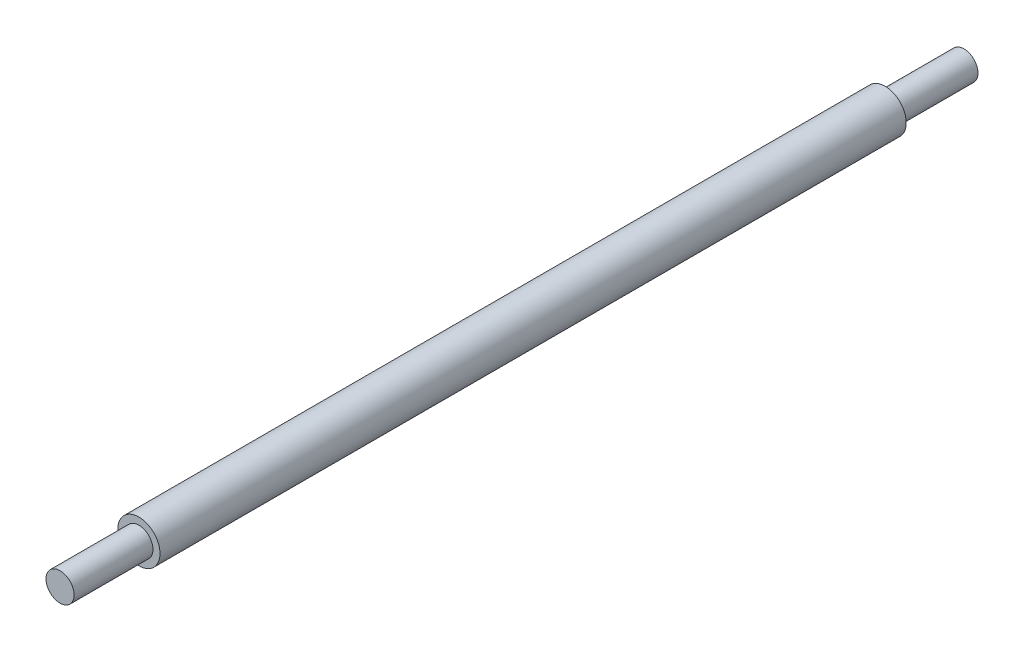
ISO-10303-21;
HEADER;
FILE_DESCRIPTION(('STEP AP214'),'2;1');
FILE_NAME('part.step','',(''),(''),'','','');
FILE_SCHEMA(('AUTOMOTIVE_DESIGN { 1 0 10303 214 1 1 1 1 }'));
ENDSEC;
DATA;
#1=APPLICATION_CONTEXT('core data for automotive mechanical design processes');
#2=APPLICATION_PROTOCOL_DEFINITION('international standard','automotive_design',2000,#1);
#3=PRODUCT_CONTEXT('',#1,'mechanical');
#4=PRODUCT('Part','Part','',(#3));
#5=PRODUCT_RELATED_PRODUCT_CATEGORY('part','',(#4));
#6=PRODUCT_DEFINITION_FORMATION('','',#4);
#7=PRODUCT_DEFINITION_CONTEXT('part definition',#1,'design');
#8=PRODUCT_DEFINITION('design','',#6,#7);
#9=PRODUCT_DEFINITION_SHAPE('','',#8);
#10=(LENGTH_UNIT() NAMED_UNIT(*) SI_UNIT(.MILLI.,.METRE.));
#11=(NAMED_UNIT(*) PLANE_ANGLE_UNIT() SI_UNIT($,.RADIAN.));
#12=(NAMED_UNIT(*) SI_UNIT($,.STERADIAN.) SOLID_ANGLE_UNIT());
#13=UNCERTAINTY_MEASURE_WITH_UNIT(LENGTH_MEASURE(1.E-05),#10,'distance_accuracy_value','');
#14=(GEOMETRIC_REPRESENTATION_CONTEXT(3) GLOBAL_UNCERTAINTY_ASSIGNED_CONTEXT((#13)) GLOBAL_UNIT_ASSIGNED_CONTEXT((#10,
#11,#12)) REPRESENTATION_CONTEXT('',''));
#15=CARTESIAN_POINT('',(0.,0.,0.));
#16=DIRECTION('',(0.,0.,1.));
#17=DIRECTION('',(1.,0.,0.));
#18=AXIS2_PLACEMENT_3D('',#15,#16,#17);
#19=CARTESIAN_POINT('',(0.,0.,336.55));
#20=DIRECTION('',(0.,0.,-1.));
#21=DIRECTION('',(-1.,0.,0.));
#22=AXIS2_PLACEMENT_3D('',#19,#20,#21);
#23=CYLINDRICAL_SURFACE('',#22,9.525);
#24=CARTESIAN_POINT('',(0.,0.,336.55));
#25=DIRECTION('',(0.,0.,1.));
#26=DIRECTION('',(1.,0.,0.));
#27=AXIS2_PLACEMENT_3D('',#24,#25,#26);
#28=CIRCLE('',#27,9.525);
#29=CARTESIAN_POINT('',(9.525,0.,336.55));
#30=VERTEX_POINT('',#29);
#31=EDGE_CURVE('E54',#30,#30,#28,.T.);
#32=ORIENTED_EDGE('',*,*,#31,.F.);
#33=EDGE_LOOP('',(#32));
#34=FACE_BOUND('',#33,.T.);
#35=CARTESIAN_POINT('',(0.,0.,0.));
#36=DIRECTION('',(0.,0.,1.));
#37=DIRECTION('',(1.,0.,0.));
#38=AXIS2_PLACEMENT_3D('',#35,#36,#37);
#39=CIRCLE('',#38,9.525);
#40=CARTESIAN_POINT('',(9.525,0.,0.));
#41=VERTEX_POINT('',#40);
#42=EDGE_CURVE('E45',#41,#41,#39,.T.);
#43=ORIENTED_EDGE('',*,*,#42,.T.);
#44=EDGE_LOOP('',(#43));
#45=FACE_BOUND('',#44,.T.);
#46=ADVANCED_FACE('F42',(#34,#45),#23,.T.);
#47=CARTESIAN_POINT('',(0.,0.,336.55));
#48=DIRECTION('',(0.,0.,1.));
#49=DIRECTION('',(1.,0.,0.));
#50=AXIS2_PLACEMENT_3D('',#47,#48,#49);
#51=PLANE('',#50);
#52=CARTESIAN_POINT('',(0.,0.,336.55));
#53=DIRECTION('',(0.,0.,1.));
#54=DIRECTION('',(1.,0.,0.));
#55=AXIS2_PLACEMENT_3D('',#52,#53,#54);
#56=CIRCLE('',#55,6.35);
#57=CARTESIAN_POINT('',(6.35,0.,336.55));
#58=VERTEX_POINT('',#57);
#59=EDGE_CURVE('E49',#58,#58,#56,.T.);
#60=ORIENTED_EDGE('',*,*,#59,.F.);
#61=EDGE_LOOP('',(#60));
#62=FACE_BOUND('',#61,.T.);
#63=ORIENTED_EDGE('',*,*,#31,.T.);
#64=EDGE_LOOP('',(#63));
#65=FACE_BOUND('',#64,.T.);
#66=ADVANCED_FACE('F71',(#62,#65),#51,.T.);
#67=CARTESIAN_POINT('',(0.,0.,0.));
#68=DIRECTION('',(0.,0.,1.));
#69=DIRECTION('',(1.,0.,0.));
#70=AXIS2_PLACEMENT_3D('',#67,#68,#69);
#71=PLANE('',#70);
#72=CARTESIAN_POINT('',(0.,0.,0.));
#73=DIRECTION('',(0.,0.,-1.));
#74=DIRECTION('',(-1.,0.,0.));
#75=AXIS2_PLACEMENT_3D('',#72,#73,#74);
#76=CIRCLE('',#75,6.35);
#77=CARTESIAN_POINT('',(-6.35,0.,0.));
#78=VERTEX_POINT('',#77);
#79=EDGE_CURVE('E12',#78,#78,#76,.T.);
#80=ORIENTED_EDGE('',*,*,#79,.F.);
#81=EDGE_LOOP('',(#80));
#82=FACE_BOUND('',#81,.T.);
#83=ORIENTED_EDGE('',*,*,#42,.F.);
#84=EDGE_LOOP('',(#83));
#85=FACE_BOUND('',#84,.T.);
#86=ADVANCED_FACE('F68',(#82,#85),#71,.F.);
#87=CARTESIAN_POINT('',(0.,0.,372.11));
#88=DIRECTION('',(0.,0.,-1.));
#89=DIRECTION('',(-1.,0.,0.));
#90=AXIS2_PLACEMENT_3D('',#87,#88,#89);
#91=CYLINDRICAL_SURFACE('',#90,6.35);
#92=CARTESIAN_POINT('',(0.,0.,372.11));
#93=DIRECTION('',(0.,0.,1.));
#94=DIRECTION('',(1.,0.,0.));
#95=AXIS2_PLACEMENT_3D('',#92,#93,#94);
#96=CIRCLE('',#95,6.35);
#97=CARTESIAN_POINT('',(6.35,0.,372.11));
#98=VERTEX_POINT('',#97);
#99=EDGE_CURVE('E59',#98,#98,#96,.T.);
#100=ORIENTED_EDGE('',*,*,#99,.F.);
#101=EDGE_LOOP('',(#100));
#102=FACE_BOUND('',#101,.T.);
#103=ORIENTED_EDGE('',*,*,#59,.T.);
#104=EDGE_LOOP('',(#103));
#105=FACE_BOUND('',#104,.T.);
#106=ADVANCED_FACE('F70',(#102,#105),#91,.T.);
#107=CARTESIAN_POINT('',(0.,0.,372.11));
#108=DIRECTION('',(0.,0.,1.));
#109=DIRECTION('',(1.,0.,0.));
#110=AXIS2_PLACEMENT_3D('',#107,#108,#109);
#111=PLANE('',#110);
#112=ORIENTED_EDGE('',*,*,#99,.T.);
#113=EDGE_LOOP('',(#112));
#114=FACE_BOUND('',#113,.T.);
#115=ADVANCED_FACE('F77',(#114),#111,.T.);
#116=CARTESIAN_POINT('',(0.,0.,-35.56));
#117=DIRECTION('',(0.,0.,1.));
#118=DIRECTION('',(1.,0.,0.));
#119=AXIS2_PLACEMENT_3D('',#116,#117,#118);
#120=CYLINDRICAL_SURFACE('',#119,6.35);
#121=CARTESIAN_POINT('',(0.,0.,-35.56));
#122=DIRECTION('',(0.,0.,-1.));
#123=DIRECTION('',(-1.,0.,0.));
#124=AXIS2_PLACEMENT_3D('',#121,#122,#123);
#125=CIRCLE('',#124,6.35);
#126=CARTESIAN_POINT('',(-6.35,0.,-35.56));
#127=VERTEX_POINT('',#126);
#128=EDGE_CURVE('E58',#127,#127,#125,.T.);
#129=ORIENTED_EDGE('',*,*,#128,.F.);
#130=EDGE_LOOP('',(#129));
#131=FACE_BOUND('',#130,.T.);
#132=ORIENTED_EDGE('',*,*,#79,.T.);
#133=EDGE_LOOP('',(#132));
#134=FACE_BOUND('',#133,.T.);
#135=ADVANCED_FACE('F105',(#131,#134),#120,.T.);
#136=CARTESIAN_POINT('',(0.,0.,-35.56));
#137=DIRECTION('',(0.,0.,-1.));
#138=DIRECTION('',(-1.,0.,0.));
#139=AXIS2_PLACEMENT_3D('',#136,#137,#138);
#140=PLANE('',#139);
#141=ORIENTED_EDGE('',*,*,#128,.T.);
#142=EDGE_LOOP('',(#141));
#143=FACE_BOUND('',#142,.T.);
#144=ADVANCED_FACE('F119',(#143),#140,.T.);
#145=CLOSED_SHELL('',(#46,#66,#86,#106,#115,#135,#144));
#146=MANIFOLD_SOLID_BREP('B2',#145);
#147=ADVANCED_BREP_SHAPE_REPRESENTATION('',(#18,#146),#14);
#148=SHAPE_DEFINITION_REPRESENTATION(#9,#147);
ENDSEC;
END-ISO-10303-21;
